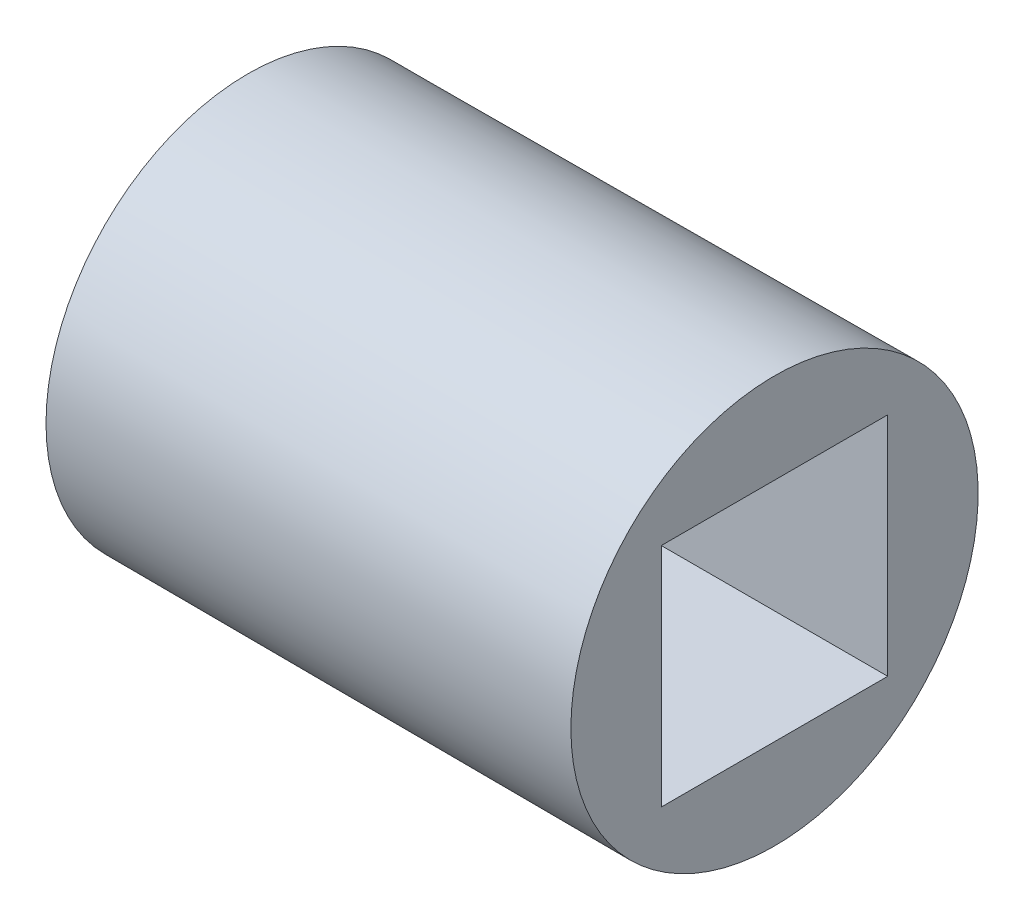
ISO-10303-21;
HEADER;
FILE_DESCRIPTION(('STEP AP214'),'2;1');
FILE_NAME('part.step','',(''),(''),'','','');
FILE_SCHEMA(('AUTOMOTIVE_DESIGN { 1 0 10303 214 1 1 1 1 }'));
ENDSEC;
DATA;
#1=APPLICATION_CONTEXT('core data for automotive mechanical design processes');
#2=APPLICATION_PROTOCOL_DEFINITION('international standard','automotive_design',2000,#1);
#3=PRODUCT_CONTEXT('',#1,'mechanical');
#4=PRODUCT('Part','Part','',(#3));
#5=PRODUCT_RELATED_PRODUCT_CATEGORY('part','',(#4));
#6=PRODUCT_DEFINITION_FORMATION('','',#4);
#7=PRODUCT_DEFINITION_CONTEXT('part definition',#1,'design');
#8=PRODUCT_DEFINITION('design','',#6,#7);
#9=PRODUCT_DEFINITION_SHAPE('','',#8);
#10=(LENGTH_UNIT() NAMED_UNIT(*) SI_UNIT(.MILLI.,.METRE.));
#11=(NAMED_UNIT(*) PLANE_ANGLE_UNIT() SI_UNIT($,.RADIAN.));
#12=(NAMED_UNIT(*) SI_UNIT($,.STERADIAN.) SOLID_ANGLE_UNIT());
#13=UNCERTAINTY_MEASURE_WITH_UNIT(LENGTH_MEASURE(1.E-05),#10,'distance_accuracy_value','');
#14=(GEOMETRIC_REPRESENTATION_CONTEXT(3) GLOBAL_UNCERTAINTY_ASSIGNED_CONTEXT((#13)) GLOBAL_UNIT_ASSIGNED_CONTEXT((#10,
#11,#12)) REPRESENTATION_CONTEXT('',''));
#15=CARTESIAN_POINT('',(0.,0.,0.));
#16=DIRECTION('',(0.,0.,1.));
#17=DIRECTION('',(1.,0.,0.));
#18=AXIS2_PLACEMENT_3D('',#15,#16,#17);
#19=CARTESIAN_POINT('',(4.35015095006169,0.,0.));
#20=DIRECTION('',(1.,0.,0.));
#21=DIRECTION('',(0.,0.,-1.));
#22=AXIS2_PLACEMENT_3D('',#19,#20,#21);
#23=PLANE('',#22);
#24=DIRECTION('',(0.,-1.,0.));
#25=VECTOR('',#24,1.);
#26=CARTESIAN_POINT('',(4.35015095006169,6.45,6.45));
#27=LINE('',#26,#25);
#28=CARTESIAN_POINT('',(4.35015095006169,6.45,6.45));
#29=VERTEX_POINT('',#28);
#30=CARTESIAN_POINT('',(4.35015095006169,-6.45,6.45));
#31=VERTEX_POINT('',#30);
#32=EDGE_CURVE('E49',#29,#31,#27,.T.);
#33=ORIENTED_EDGE('',*,*,#32,.F.);
#34=DIRECTION('',(0.,0.,1.));
#35=VECTOR('',#34,1.);
#36=CARTESIAN_POINT('',(4.35015095006169,6.45,-6.45));
#37=LINE('',#36,#35);
#38=CARTESIAN_POINT('',(4.35015095006169,6.45,-6.45));
#39=VERTEX_POINT('',#38);
#40=EDGE_CURVE('E100',#39,#29,#37,.T.);
#41=ORIENTED_EDGE('',*,*,#40,.F.);
#42=DIRECTION('',(0.,1.,0.));
#43=VECTOR('',#42,1.);
#44=CARTESIAN_POINT('',(4.35015095006169,-6.45,-6.45));
#45=LINE('',#44,#43);
#46=CARTESIAN_POINT('',(4.35015095006169,-6.45,-6.45));
#47=VERTEX_POINT('',#46);
#48=EDGE_CURVE('E106',#47,#39,#45,.T.);
#49=ORIENTED_EDGE('',*,*,#48,.F.);
#50=DIRECTION('',(0.,0.,-1.));
#51=VECTOR('',#50,1.);
#52=CARTESIAN_POINT('',(4.35015095006169,-6.45,6.45));
#53=LINE('',#52,#51);
#54=EDGE_CURVE('E84',#31,#47,#53,.T.);
#55=ORIENTED_EDGE('',*,*,#54,.F.);
#56=EDGE_LOOP('',(#33,#41,#49,#55));
#57=FACE_BOUND('',#56,.T.);
#58=CARTESIAN_POINT('',(4.35015095006169,0.,0.));
#59=DIRECTION('',(-1.,0.,0.));
#60=DIRECTION('',(0.,0.,1.));
#61=AXIS2_PLACEMENT_3D('',#58,#59,#60);
#62=CIRCLE('',#61,11.6);
#63=CARTESIAN_POINT('',(4.35015095006169,0.,11.6));
#64=VERTEX_POINT('',#63);
#65=EDGE_CURVE('E11',#64,#64,#62,.T.);
#66=ORIENTED_EDGE('',*,*,#65,.F.);
#67=EDGE_LOOP('',(#66));
#68=FACE_BOUND('',#67,.T.);
#69=ADVANCED_FACE('F35',(#57,#68),#23,.T.);
#70=CARTESIAN_POINT('',(-25.6498490499383,0.,0.));
#71=DIRECTION('',(1.,0.,0.));
#72=DIRECTION('',(0.,0.,-1.));
#73=AXIS2_PLACEMENT_3D('',#70,#71,#72);
#74=CONICAL_SURFACE('',#73,11.5,0.00333332098773661);
#75=ORIENTED_EDGE('',*,*,#65,.T.);
#76=EDGE_LOOP('',(#75));
#77=FACE_BOUND('',#76,.T.);
#78=CARTESIAN_POINT('',(-25.6498490499383,0.,0.));
#79=DIRECTION('',(-1.,0.,0.));
#80=DIRECTION('',(0.,0.,1.));
#81=AXIS2_PLACEMENT_3D('',#78,#79,#80);
#82=CIRCLE('',#81,11.5);
#83=CARTESIAN_POINT('',(-25.6498490499383,0.,11.5));
#84=VERTEX_POINT('',#83);
#85=EDGE_CURVE('E42',#84,#84,#82,.T.);
#86=ORIENTED_EDGE('',*,*,#85,.F.);
#87=EDGE_LOOP('',(#86));
#88=FACE_BOUND('',#87,.T.);
#89=ADVANCED_FACE('F116',(#77,#88),#74,.T.);
#90=CARTESIAN_POINT('',(-25.6498490499383,0.,0.));
#91=DIRECTION('',(-1.,0.,0.));
#92=DIRECTION('',(0.,0.,1.));
#93=AXIS2_PLACEMENT_3D('',#90,#91,#92);
#94=PLANE('',#93);
#95=ORIENTED_EDGE('',*,*,#85,.T.);
#96=EDGE_LOOP('',(#95));
#97=FACE_BOUND('',#96,.T.);
#98=ADVANCED_FACE('F114',(#97),#94,.T.);
#99=CARTESIAN_POINT('',(-20.6498490499383,6.45,6.45));
#100=DIRECTION('',(0.,0.,1.));
#101=DIRECTION('',(1.,0.,0.));
#102=AXIS2_PLACEMENT_3D('',#99,#100,#101);
#103=PLANE('',#102);
#104=ORIENTED_EDGE('',*,*,#32,.T.);
#105=DIRECTION('',(1.,0.,0.));
#106=VECTOR('',#105,1.);
#107=CARTESIAN_POINT('',(-20.6498490499383,-6.45,6.45));
#108=LINE('',#107,#106);
#109=CARTESIAN_POINT('',(-20.6498490499383,-6.45,6.45));
#110=VERTEX_POINT('',#109);
#111=EDGE_CURVE('E72',#110,#31,#108,.T.);
#112=ORIENTED_EDGE('',*,*,#111,.F.);
#113=DIRECTION('',(0.,-1.,0.));
#114=VECTOR('',#113,1.);
#115=CARTESIAN_POINT('',(-20.6498490499383,6.45,6.45));
#116=LINE('',#115,#114);
#117=CARTESIAN_POINT('',(-20.6498490499383,6.45,6.45));
#118=VERTEX_POINT('',#117);
#119=EDGE_CURVE('E98',#118,#110,#116,.T.);
#120=ORIENTED_EDGE('',*,*,#119,.F.);
#121=DIRECTION('',(1.,0.,0.));
#122=VECTOR('',#121,1.);
#123=CARTESIAN_POINT('',(-20.6498490499383,6.45,6.45));
#124=LINE('',#123,#122);
#125=EDGE_CURVE('E57',#118,#29,#124,.T.);
#126=ORIENTED_EDGE('',*,*,#125,.T.);
#127=EDGE_LOOP('',(#104,#112,#120,#126));
#128=FACE_BOUND('',#127,.T.);
#129=ADVANCED_FACE('F123',(#128),#103,.F.);
#130=CARTESIAN_POINT('',(-20.6498490499383,6.45,-6.45));
#131=DIRECTION('',(0.,1.,0.));
#132=DIRECTION('',(0.,0.,1.));
#133=AXIS2_PLACEMENT_3D('',#130,#131,#132);
#134=PLANE('',#133);
#135=ORIENTED_EDGE('',*,*,#40,.T.);
#136=ORIENTED_EDGE('',*,*,#125,.F.);
#137=DIRECTION('',(0.,0.,1.));
#138=VECTOR('',#137,1.);
#139=CARTESIAN_POINT('',(-20.6498490499383,6.45,-6.45));
#140=LINE('',#139,#138);
#141=CARTESIAN_POINT('',(-20.6498490499383,6.45,-6.45));
#142=VERTEX_POINT('',#141);
#143=EDGE_CURVE('E95',#142,#118,#140,.T.);
#144=ORIENTED_EDGE('',*,*,#143,.F.);
#145=DIRECTION('',(1.,0.,0.));
#146=VECTOR('',#145,1.);
#147=CARTESIAN_POINT('',(-20.6498490499383,6.45,-6.45));
#148=LINE('',#147,#146);
#149=EDGE_CURVE('E88',#142,#39,#148,.T.);
#150=ORIENTED_EDGE('',*,*,#149,.T.);
#151=EDGE_LOOP('',(#135,#136,#144,#150));
#152=FACE_BOUND('',#151,.T.);
#153=ADVANCED_FACE('F129',(#152),#134,.F.);
#154=CARTESIAN_POINT('',(-20.6498490499383,-6.45,-6.45));
#155=DIRECTION('',(0.,0.,-1.));
#156=DIRECTION('',(-1.,0.,0.));
#157=AXIS2_PLACEMENT_3D('',#154,#155,#156);
#158=PLANE('',#157);
#159=ORIENTED_EDGE('',*,*,#48,.T.);
#160=ORIENTED_EDGE('',*,*,#149,.F.);
#161=DIRECTION('',(0.,1.,0.));
#162=VECTOR('',#161,1.);
#163=CARTESIAN_POINT('',(-20.6498490499383,-6.45,-6.45));
#164=LINE('',#163,#162);
#165=CARTESIAN_POINT('',(-20.6498490499383,-6.45,-6.45));
#166=VERTEX_POINT('',#165);
#167=EDGE_CURVE('E91',#166,#142,#164,.T.);
#168=ORIENTED_EDGE('',*,*,#167,.F.);
#169=DIRECTION('',(1.,0.,0.));
#170=VECTOR('',#169,1.);
#171=CARTESIAN_POINT('',(-20.6498490499383,-6.45,-6.45));
#172=LINE('',#171,#170);
#173=EDGE_CURVE('E77',#166,#47,#172,.T.);
#174=ORIENTED_EDGE('',*,*,#173,.T.);
#175=EDGE_LOOP('',(#159,#160,#168,#174));
#176=FACE_BOUND('',#175,.T.);
#177=ADVANCED_FACE('F92',(#176),#158,.F.);
#178=CARTESIAN_POINT('',(-20.6498490499383,-6.45,6.45));
#179=DIRECTION('',(0.,-1.,0.));
#180=DIRECTION('',(0.,0.,-1.));
#181=AXIS2_PLACEMENT_3D('',#178,#179,#180);
#182=PLANE('',#181);
#183=ORIENTED_EDGE('',*,*,#54,.T.);
#184=ORIENTED_EDGE('',*,*,#173,.F.);
#185=DIRECTION('',(0.,0.,-1.));
#186=VECTOR('',#185,1.);
#187=CARTESIAN_POINT('',(-20.6498490499383,-6.45,6.45));
#188=LINE('',#187,#186);
#189=EDGE_CURVE('E81',#110,#166,#188,.T.);
#190=ORIENTED_EDGE('',*,*,#189,.F.);
#191=ORIENTED_EDGE('',*,*,#111,.T.);
#192=EDGE_LOOP('',(#183,#184,#190,#191));
#193=FACE_BOUND('',#192,.T.);
#194=ADVANCED_FACE('F79',(#193),#182,.F.);
#195=CARTESIAN_POINT('',(-20.6498490499383,0.,0.));
#196=DIRECTION('',(1.,0.,0.));
#197=DIRECTION('',(0.,0.,-1.));
#198=AXIS2_PLACEMENT_3D('',#195,#196,#197);
#199=PLANE('',#198);
#200=ORIENTED_EDGE('',*,*,#119,.T.);
#201=ORIENTED_EDGE('',*,*,#189,.T.);
#202=ORIENTED_EDGE('',*,*,#167,.T.);
#203=ORIENTED_EDGE('',*,*,#143,.T.);
#204=EDGE_LOOP('',(#200,#201,#202,#203));
#205=FACE_BOUND('',#204,.T.);
#206=ADVANCED_FACE('F97',(#205),#199,.T.);
#207=CLOSED_SHELL('',(#69,#89,#98,#129,#153,#177,#194,#206));
#208=MANIFOLD_SOLID_BREP('B2',#207);
#209=ADVANCED_BREP_SHAPE_REPRESENTATION('',(#18,#208),#14);
#210=SHAPE_DEFINITION_REPRESENTATION(#9,#209);
ENDSEC;
END-ISO-10303-21;
